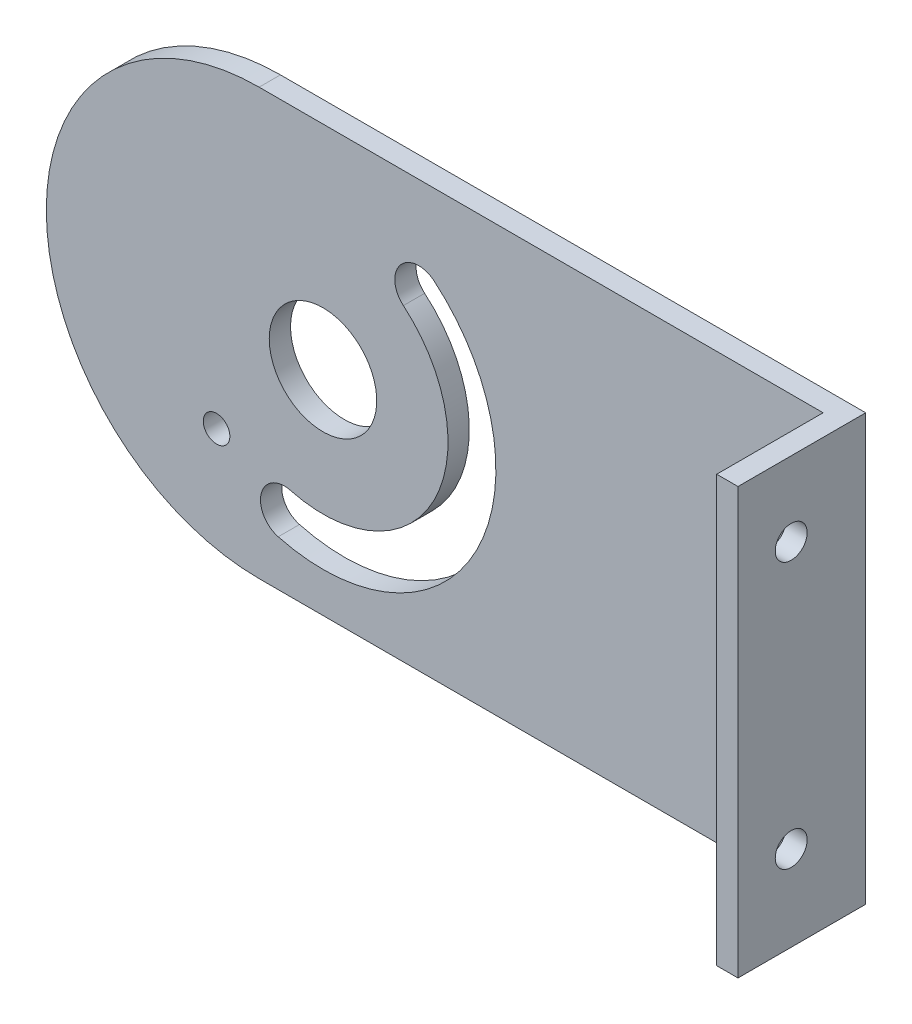
ISO-10303-21;
HEADER;
FILE_DESCRIPTION(('STEP AP214'),'2;1');
FILE_NAME('part.step','',(''),(''),'','','');
FILE_SCHEMA(('AUTOMOTIVE_DESIGN { 1 0 10303 214 1 1 1 1 }'));
ENDSEC;
DATA;
#1=APPLICATION_CONTEXT('core data for automotive mechanical design processes');
#2=APPLICATION_PROTOCOL_DEFINITION('international standard','automotive_design',2000,#1);
#3=PRODUCT_CONTEXT('',#1,'mechanical');
#4=PRODUCT('Part','Part','',(#3));
#5=PRODUCT_RELATED_PRODUCT_CATEGORY('part','',(#4));
#6=PRODUCT_DEFINITION_FORMATION('','',#4);
#7=PRODUCT_DEFINITION_CONTEXT('part definition',#1,'design');
#8=PRODUCT_DEFINITION('design','',#6,#7);
#9=PRODUCT_DEFINITION_SHAPE('','',#8);
#10=(LENGTH_UNIT() NAMED_UNIT(*) SI_UNIT(.MILLI.,.METRE.));
#11=(NAMED_UNIT(*) PLANE_ANGLE_UNIT() SI_UNIT($,.RADIAN.));
#12=(NAMED_UNIT(*) SI_UNIT($,.STERADIAN.) SOLID_ANGLE_UNIT());
#13=UNCERTAINTY_MEASURE_WITH_UNIT(LENGTH_MEASURE(1.E-05),#10,'distance_accuracy_value','');
#14=(GEOMETRIC_REPRESENTATION_CONTEXT(3) GLOBAL_UNCERTAINTY_ASSIGNED_CONTEXT((#13)) GLOBAL_UNIT_ASSIGNED_CONTEXT((#10,
#11,#12)) REPRESENTATION_CONTEXT('',''));
#15=CARTESIAN_POINT('',(0.,0.,0.));
#16=DIRECTION('',(0.,0.,1.));
#17=DIRECTION('',(1.,0.,0.));
#18=AXIS2_PLACEMENT_3D('',#15,#16,#17);
#19=CARTESIAN_POINT('',(75.,0.,2.));
#20=DIRECTION('',(0.,1.,0.));
#21=DIRECTION('',(-1.,0.,0.));
#22=AXIS2_PLACEMENT_3D('',#19,#20,#21);
#23=PLANE('',#22);
#24=DIRECTION('',(1.,0.,0.));
#25=VECTOR('',#24,1.);
#26=CARTESIAN_POINT('',(75.,0.,0.));
#27=LINE('',#26,#25);
#28=CARTESIAN_POINT('',(20.,0.,0.));
#29=VERTEX_POINT('',#28);
#30=CARTESIAN_POINT('',(75.,0.,0.));
#31=VERTEX_POINT('',#30);
#32=EDGE_CURVE('E133',#29,#31,#27,.T.);
#33=ORIENTED_EDGE('',*,*,#32,.T.);
#34=DIRECTION('',(0.,0.,-1.));
#35=VECTOR('',#34,1.);
#36=CARTESIAN_POINT('',(75.,0.,2.));
#37=LINE('',#36,#35);
#38=CARTESIAN_POINT('',(75.,0.,12.));
#39=VERTEX_POINT('',#38);
#40=EDGE_CURVE('E123',#39,#31,#37,.T.);
#41=ORIENTED_EDGE('',*,*,#40,.F.);
#42=DIRECTION('',(-1.,0.,0.));
#43=VECTOR('',#42,1.);
#44=CARTESIAN_POINT('',(75.,0.,12.));
#45=LINE('',#44,#43);
#46=CARTESIAN_POINT('',(73.,0.,12.));
#47=VERTEX_POINT('',#46);
#48=EDGE_CURVE('E126',#39,#47,#45,.T.);
#49=ORIENTED_EDGE('',*,*,#48,.T.);
#50=DIRECTION('',(0.,0.,-1.));
#51=VECTOR('',#50,1.);
#52=CARTESIAN_POINT('',(73.,0.,12.));
#53=LINE('',#52,#51);
#54=CARTESIAN_POINT('',(73.,0.,2.));
#55=VERTEX_POINT('',#54);
#56=EDGE_CURVE('E158',#47,#55,#53,.T.);
#57=ORIENTED_EDGE('',*,*,#56,.T.);
#58=DIRECTION('',(1.,0.,0.));
#59=VECTOR('',#58,1.);
#60=CARTESIAN_POINT('',(75.,0.,2.));
#61=LINE('',#60,#59);
#62=CARTESIAN_POINT('',(20.,0.,2.));
#63=VERTEX_POINT('',#62);
#64=EDGE_CURVE('E62',#63,#55,#61,.T.);
#65=ORIENTED_EDGE('',*,*,#64,.F.);
#66=DIRECTION('',(0.,0.,-1.));
#67=VECTOR('',#66,1.);
#68=CARTESIAN_POINT('',(20.,0.,2.));
#69=LINE('',#68,#67);
#70=EDGE_CURVE('E132',#63,#29,#69,.T.);
#71=ORIENTED_EDGE('',*,*,#70,.T.);
#72=EDGE_LOOP('',(#33,#41,#49,#57,#65,#71));
#73=FACE_BOUND('',#72,.T.);
#74=ADVANCED_FACE('F43',(#73),#23,.F.);
#75=CARTESIAN_POINT('',(75.,40.,2.));
#76=DIRECTION('',(-1.,0.,0.));
#77=DIRECTION('',(0.,0.,1.));
#78=AXIS2_PLACEMENT_3D('',#75,#76,#77);
#79=PLANE('',#78);
#80=CARTESIAN_POINT('',(75.,33.,7.));
#81=DIRECTION('',(-1.,0.,0.));
#82=DIRECTION('',(0.,0.,1.));
#83=AXIS2_PLACEMENT_3D('',#80,#81,#82);
#84=CIRCLE('',#83,1.5);
#85=CARTESIAN_POINT('',(75.,33.,8.5));
#86=VERTEX_POINT('',#85);
#87=EDGE_CURVE('E149',#86,#86,#84,.T.);
#88=ORIENTED_EDGE('',*,*,#87,.T.);
#89=EDGE_LOOP('',(#88));
#90=FACE_BOUND('',#89,.T.);
#91=CARTESIAN_POINT('',(75.,8.,7.));
#92=DIRECTION('',(-1.,0.,0.));
#93=DIRECTION('',(0.,0.,1.));
#94=AXIS2_PLACEMENT_3D('',#91,#92,#93);
#95=CIRCLE('',#94,1.5);
#96=CARTESIAN_POINT('',(75.,8.,8.5));
#97=VERTEX_POINT('',#96);
#98=EDGE_CURVE('E151',#97,#97,#95,.T.);
#99=ORIENTED_EDGE('',*,*,#98,.T.);
#100=EDGE_LOOP('',(#99));
#101=FACE_BOUND('',#100,.T.);
#102=DIRECTION('',(0.,1.,0.));
#103=VECTOR('',#102,1.);
#104=CARTESIAN_POINT('',(75.,40.,0.));
#105=LINE('',#104,#103);
#106=CARTESIAN_POINT('',(75.,40.,0.));
#107=VERTEX_POINT('',#106);
#108=EDGE_CURVE('E214',#31,#107,#105,.T.);
#109=ORIENTED_EDGE('',*,*,#108,.T.);
#110=DIRECTION('',(0.,0.,-1.));
#111=VECTOR('',#110,1.);
#112=CARTESIAN_POINT('',(75.,40.,2.));
#113=LINE('',#112,#111);
#114=CARTESIAN_POINT('',(75.,40.,12.));
#115=VERTEX_POINT('',#114);
#116=EDGE_CURVE('E137',#115,#107,#113,.T.);
#117=ORIENTED_EDGE('',*,*,#116,.F.);
#118=DIRECTION('',(0.,-1.,0.));
#119=VECTOR('',#118,1.);
#120=CARTESIAN_POINT('',(75.,0.,12.));
#121=LINE('',#120,#119);
#122=EDGE_CURVE('E141',#115,#39,#121,.T.);
#123=ORIENTED_EDGE('',*,*,#122,.T.);
#124=ORIENTED_EDGE('',*,*,#40,.T.);
#125=EDGE_LOOP('',(#109,#117,#123,#124));
#126=FACE_BOUND('',#125,.T.);
#127=ADVANCED_FACE('F146',(#90,#101,#126),#79,.F.);
#128=CARTESIAN_POINT('',(0.,40.,2.));
#129=DIRECTION('',(0.,-1.,0.));
#130=DIRECTION('',(0.,0.,-1.));
#131=AXIS2_PLACEMENT_3D('',#128,#129,#130);
#132=PLANE('',#131);
#133=DIRECTION('',(-1.,0.,0.));
#134=VECTOR('',#133,1.);
#135=CARTESIAN_POINT('',(0.,40.,2.));
#136=LINE('',#135,#134);
#137=CARTESIAN_POINT('',(73.,40.,2.));
#138=VERTEX_POINT('',#137);
#139=CARTESIAN_POINT('',(20.,40.,2.));
#140=VERTEX_POINT('',#139);
#141=EDGE_CURVE('E213',#138,#140,#136,.T.);
#142=ORIENTED_EDGE('',*,*,#141,.F.);
#143=DIRECTION('',(0.,0.,-1.));
#144=VECTOR('',#143,1.);
#145=CARTESIAN_POINT('',(73.,40.,12.));
#146=LINE('',#145,#144);
#147=CARTESIAN_POINT('',(73.,40.,12.));
#148=VERTEX_POINT('',#147);
#149=EDGE_CURVE('E163',#148,#138,#146,.T.);
#150=ORIENTED_EDGE('',*,*,#149,.F.);
#151=DIRECTION('',(1.,0.,0.));
#152=VECTOR('',#151,1.);
#153=CARTESIAN_POINT('',(75.,40.,12.));
#154=LINE('',#153,#152);
#155=EDGE_CURVE('E160',#148,#115,#154,.T.);
#156=ORIENTED_EDGE('',*,*,#155,.T.);
#157=ORIENTED_EDGE('',*,*,#116,.T.);
#158=DIRECTION('',(-1.,0.,0.));
#159=VECTOR('',#158,1.);
#160=CARTESIAN_POINT('',(0.,40.,0.));
#161=LINE('',#160,#159);
#162=CARTESIAN_POINT('',(20.,40.,0.));
#163=VERTEX_POINT('',#162);
#164=EDGE_CURVE('E215',#107,#163,#161,.T.);
#165=ORIENTED_EDGE('',*,*,#164,.T.);
#166=DIRECTION('',(0.,0.,-1.));
#167=VECTOR('',#166,1.);
#168=CARTESIAN_POINT('',(20.,40.,2.));
#169=LINE('',#168,#167);
#170=EDGE_CURVE('E11',#163,#140,#169,.F.);
#171=ORIENTED_EDGE('',*,*,#170,.T.);
#172=EDGE_LOOP('',(#142,#150,#156,#157,#165,#171));
#173=FACE_BOUND('',#172,.T.);
#174=ADVANCED_FACE('F243',(#173),#132,.F.);
#175=CARTESIAN_POINT('',(0.,0.,2.));
#176=DIRECTION('',(0.,0.,-1.));
#177=DIRECTION('',(-1.,0.,0.));
#178=AXIS2_PLACEMENT_3D('',#175,#176,#177);
#179=PLANE('',#178);
#180=CARTESIAN_POINT('',(16.,10.2020410288673,2.));
#181=DIRECTION('',(0.,0.,-1.));
#182=DIRECTION('',(-1.,0.,0.));
#183=AXIS2_PLACEMENT_3D('',#180,#181,#182);
#184=CIRCLE('',#183,1.25000000000004);
#185=CARTESIAN_POINT('',(14.75,10.2020410288673,2.));
#186=VERTEX_POINT('',#185);
#187=EDGE_CURVE('E204',#186,#186,#184,.T.);
#188=ORIENTED_EDGE('',*,*,#187,.T.);
#189=EDGE_LOOP('',(#188));
#190=FACE_BOUND('',#189,.T.);
#191=CARTESIAN_POINT('',(26.,20.,2.));
#192=DIRECTION('',(0.,0.,1.));
#193=DIRECTION('',(-1.,0.,0.));
#194=AXIS2_PLACEMENT_3D('',#191,#192,#193);
#195=CIRCLE('',#194,11.75);
#196=CARTESIAN_POINT('',(22.9578459976906,8.65064763846709,2.));
#197=VERTEX_POINT('',#196);
#198=CARTESIAN_POINT('',(33.5535714285714,29.0003365866766,2.));
#199=VERTEX_POINT('',#198);
#200=EDGE_CURVE('E169',#197,#199,#195,.T.);
#201=ORIENTED_EDGE('',*,*,#200,.T.);
#202=CARTESIAN_POINT('',(35.,30.7238052947636,2.));
#203=DIRECTION('',(0.,0.,-1.));
#204=DIRECTION('',(-1.,0.,0.));
#205=AXIS2_PLACEMENT_3D('',#202,#203,#204);
#206=CIRCLE('',#205,2.25);
#207=CARTESIAN_POINT('',(36.4464285714286,32.4472740028506,2.));
#208=VERTEX_POINT('',#207);
#209=EDGE_CURVE('E181',#199,#208,#206,.T.);
#210=ORIENTED_EDGE('',*,*,#209,.T.);
#211=CARTESIAN_POINT('',(26.,20.,2.));
#212=DIRECTION('',(0.,0.,-1.));
#213=DIRECTION('',(-1.,0.,0.));
#214=AXIS2_PLACEMENT_3D('',#211,#212,#213);
#215=CIRCLE('',#214,16.25);
#216=CARTESIAN_POINT('',(21.792765741487,4.30408715958214,2.));
#217=VERTEX_POINT('',#216);
#218=EDGE_CURVE('E194',#208,#217,#215,.T.);
#219=ORIENTED_EDGE('',*,*,#218,.T.);
#220=CARTESIAN_POINT('',(22.3753058695888,6.47736739902462,2.));
#221=DIRECTION('',(0.,0.,-1.));
#222=DIRECTION('',(-1.,0.,0.));
#223=AXIS2_PLACEMENT_3D('',#220,#221,#222);
#224=CIRCLE('',#223,2.25);
#225=EDGE_CURVE('E195',#217,#197,#224,.T.);
#226=ORIENTED_EDGE('',*,*,#225,.T.);
#227=EDGE_LOOP('',(#201,#210,#219,#226));
#228=FACE_BOUND('',#227,.T.);
#229=CARTESIAN_POINT('',(26.,20.,2.));
#230=DIRECTION('',(0.,0.,-1.));
#231=DIRECTION('',(-1.,0.,0.));
#232=AXIS2_PLACEMENT_3D('',#229,#230,#231);
#233=CIRCLE('',#232,5.05000000000008);
#234=CARTESIAN_POINT('',(20.9499999999999,20.,2.));
#235=VERTEX_POINT('',#234);
#236=EDGE_CURVE('E203',#235,#235,#233,.T.);
#237=ORIENTED_EDGE('',*,*,#236,.T.);
#238=EDGE_LOOP('',(#237));
#239=FACE_BOUND('',#238,.T.);
#240=ORIENTED_EDGE('',*,*,#64,.T.);
#241=DIRECTION('',(0.,1.,0.));
#242=VECTOR('',#241,1.);
#243=CARTESIAN_POINT('',(73.,0.,2.));
#244=LINE('',#243,#242);
#245=EDGE_CURVE('E56',#55,#138,#244,.T.);
#246=ORIENTED_EDGE('',*,*,#245,.T.);
#247=ORIENTED_EDGE('',*,*,#141,.T.);
#248=CARTESIAN_POINT('',(20.,20.,2.));
#249=DIRECTION('',(0.,0.,-1.));
#250=DIRECTION('',(-1.,0.,0.));
#251=AXIS2_PLACEMENT_3D('',#248,#249,#250);
#252=CIRCLE('',#251,20.);
#253=CARTESIAN_POINT('',(0.,20.,2.));
#254=VERTEX_POINT('',#253);
#255=EDGE_CURVE('E223',#140,#254,#252,.F.);
#256=ORIENTED_EDGE('',*,*,#255,.T.);
#257=CARTESIAN_POINT('',(20.,20.,2.));
#258=DIRECTION('',(0.,0.,-1.));
#259=DIRECTION('',(-1.,0.,0.));
#260=AXIS2_PLACEMENT_3D('',#257,#258,#259);
#261=CIRCLE('',#260,20.);
#262=EDGE_CURVE('E55',#254,#63,#261,.F.);
#263=ORIENTED_EDGE('',*,*,#262,.T.);
#264=EDGE_LOOP('',(#240,#246,#247,#256,#263));
#265=FACE_BOUND('',#264,.T.);
#266=ADVANCED_FACE('F226',(#190,#228,#239,#265),#179,.F.);
#267=CARTESIAN_POINT('',(0.,0.,0.));
#268=DIRECTION('',(0.,0.,-1.));
#269=DIRECTION('',(-1.,0.,0.));
#270=AXIS2_PLACEMENT_3D('',#267,#268,#269);
#271=PLANE('',#270);
#272=CARTESIAN_POINT('',(20.,20.,0.));
#273=DIRECTION('',(0.,0.,-1.));
#274=DIRECTION('',(-1.,0.,0.));
#275=AXIS2_PLACEMENT_3D('',#272,#273,#274);
#276=CIRCLE('',#275,20.);
#277=CARTESIAN_POINT('',(0.,20.,0.));
#278=VERTEX_POINT('',#277);
#279=EDGE_CURVE('E217',#278,#163,#276,.T.);
#280=ORIENTED_EDGE('',*,*,#279,.T.);
#281=ORIENTED_EDGE('',*,*,#164,.F.);
#282=ORIENTED_EDGE('',*,*,#108,.F.);
#283=ORIENTED_EDGE('',*,*,#32,.F.);
#284=CARTESIAN_POINT('',(20.,20.,0.));
#285=DIRECTION('',(0.,0.,-1.));
#286=DIRECTION('',(-1.,0.,0.));
#287=AXIS2_PLACEMENT_3D('',#284,#285,#286);
#288=CIRCLE('',#287,20.);
#289=EDGE_CURVE('E225',#29,#278,#288,.T.);
#290=ORIENTED_EDGE('',*,*,#289,.T.);
#291=EDGE_LOOP('',(#280,#281,#282,#283,#290));
#292=FACE_BOUND('',#291,.T.);
#293=CARTESIAN_POINT('',(16.,10.2020410288673,0.));
#294=DIRECTION('',(0.,0.,-1.));
#295=DIRECTION('',(-1.,0.,0.));
#296=AXIS2_PLACEMENT_3D('',#293,#294,#295);
#297=CIRCLE('',#296,1.25000000000004);
#298=CARTESIAN_POINT('',(14.75,10.2020410288673,0.));
#299=VERTEX_POINT('',#298);
#300=EDGE_CURVE('E176',#299,#299,#297,.T.);
#301=ORIENTED_EDGE('',*,*,#300,.F.);
#302=EDGE_LOOP('',(#301));
#303=FACE_BOUND('',#302,.T.);
#304=CARTESIAN_POINT('',(35.,30.7238052947636,0.));
#305=DIRECTION('',(0.,0.,-1.));
#306=DIRECTION('',(-1.,0.,0.));
#307=AXIS2_PLACEMENT_3D('',#304,#305,#306);
#308=CIRCLE('',#307,2.25);
#309=CARTESIAN_POINT('',(33.5535714285714,29.0003365866766,0.));
#310=VERTEX_POINT('',#309);
#311=CARTESIAN_POINT('',(36.4464285714286,32.4472740028506,0.));
#312=VERTEX_POINT('',#311);
#313=EDGE_CURVE('E190',#310,#312,#308,.T.);
#314=ORIENTED_EDGE('',*,*,#313,.F.);
#315=CARTESIAN_POINT('',(26.,20.,0.));
#316=DIRECTION('',(0.,0.,1.));
#317=DIRECTION('',(-1.,0.,0.));
#318=AXIS2_PLACEMENT_3D('',#315,#316,#317);
#319=CIRCLE('',#318,11.75);
#320=CARTESIAN_POINT('',(22.9578459976906,8.65064763846709,0.));
#321=VERTEX_POINT('',#320);
#322=EDGE_CURVE('E180',#321,#310,#319,.T.);
#323=ORIENTED_EDGE('',*,*,#322,.F.);
#324=CARTESIAN_POINT('',(22.3753058695888,6.47736739902462,0.));
#325=DIRECTION('',(0.,0.,-1.));
#326=DIRECTION('',(-1.,0.,0.));
#327=AXIS2_PLACEMENT_3D('',#324,#325,#326);
#328=CIRCLE('',#327,2.25);
#329=CARTESIAN_POINT('',(21.792765741487,4.30408715958214,0.));
#330=VERTEX_POINT('',#329);
#331=EDGE_CURVE('E179',#330,#321,#328,.T.);
#332=ORIENTED_EDGE('',*,*,#331,.F.);
#333=CARTESIAN_POINT('',(26.,20.,0.));
#334=DIRECTION('',(0.,0.,-1.));
#335=DIRECTION('',(-1.,0.,0.));
#336=AXIS2_PLACEMENT_3D('',#333,#334,#335);
#337=CIRCLE('',#336,16.25);
#338=EDGE_CURVE('E183',#312,#330,#337,.T.);
#339=ORIENTED_EDGE('',*,*,#338,.F.);
#340=EDGE_LOOP('',(#314,#323,#332,#339));
#341=FACE_BOUND('',#340,.T.);
#342=CARTESIAN_POINT('',(26.,20.,0.));
#343=DIRECTION('',(0.,0.,-1.));
#344=DIRECTION('',(-1.,0.,0.));
#345=AXIS2_PLACEMENT_3D('',#342,#343,#344);
#346=CIRCLE('',#345,5.05000000000008);
#347=CARTESIAN_POINT('',(20.9499999999999,20.,0.));
#348=VERTEX_POINT('',#347);
#349=EDGE_CURVE('E186',#348,#348,#346,.T.);
#350=ORIENTED_EDGE('',*,*,#349,.F.);
#351=EDGE_LOOP('',(#350));
#352=FACE_BOUND('',#351,.T.);
#353=ADVANCED_FACE('F240',(#292,#303,#341,#352),#271,.T.);
#354=CARTESIAN_POINT('',(26.,20.,2.));
#355=DIRECTION('',(0.,0.,-1.));
#356=DIRECTION('',(-1.,0.,0.));
#357=AXIS2_PLACEMENT_3D('',#354,#355,#356);
#358=CYLINDRICAL_SURFACE('',#357,5.05000000000008);
#359=ORIENTED_EDGE('',*,*,#236,.F.);
#360=EDGE_LOOP('',(#359));
#361=FACE_BOUND('',#360,.T.);
#362=ORIENTED_EDGE('',*,*,#349,.T.);
#363=EDGE_LOOP('',(#362));
#364=FACE_BOUND('',#363,.T.);
#365=ADVANCED_FACE('F272',(#361,#364),#358,.F.);
#366=CARTESIAN_POINT('',(35.,30.7238052947636,2.));
#367=DIRECTION('',(0.,0.,-1.));
#368=DIRECTION('',(-1.,0.,0.));
#369=AXIS2_PLACEMENT_3D('',#366,#367,#368);
#370=CYLINDRICAL_SURFACE('',#369,2.25);
#371=ORIENTED_EDGE('',*,*,#313,.T.);
#372=DIRECTION('',(0.,0.,-1.));
#373=VECTOR('',#372,1.);
#374=CARTESIAN_POINT('',(36.4464285714286,32.4472740028506,2.));
#375=LINE('',#374,#373);
#376=EDGE_CURVE('E168',#208,#312,#375,.T.);
#377=ORIENTED_EDGE('',*,*,#376,.F.);
#378=ORIENTED_EDGE('',*,*,#209,.F.);
#379=DIRECTION('',(0.,0.,-1.));
#380=VECTOR('',#379,1.);
#381=CARTESIAN_POINT('',(33.5535714285714,29.0003365866766,2.));
#382=LINE('',#381,#380);
#383=EDGE_CURVE('E172',#199,#310,#382,.T.);
#384=ORIENTED_EDGE('',*,*,#383,.T.);
#385=EDGE_LOOP('',(#371,#377,#378,#384));
#386=FACE_BOUND('',#385,.T.);
#387=ADVANCED_FACE('F280',(#386),#370,.F.);
#388=CARTESIAN_POINT('',(26.,20.,2.));
#389=DIRECTION('',(0.,0.,-1.));
#390=DIRECTION('',(-1.,0.,0.));
#391=AXIS2_PLACEMENT_3D('',#388,#389,#390);
#392=CYLINDRICAL_SURFACE('',#391,11.75);
#393=ORIENTED_EDGE('',*,*,#322,.T.);
#394=ORIENTED_EDGE('',*,*,#383,.F.);
#395=ORIENTED_EDGE('',*,*,#200,.F.);
#396=DIRECTION('',(0.,0.,-1.));
#397=VECTOR('',#396,1.);
#398=CARTESIAN_POINT('',(22.9578459976906,8.65064763846709,2.));
#399=LINE('',#398,#397);
#400=EDGE_CURVE('E175',#197,#321,#399,.T.);
#401=ORIENTED_EDGE('',*,*,#400,.T.);
#402=EDGE_LOOP('',(#393,#394,#395,#401));
#403=FACE_BOUND('',#402,.T.);
#404=ADVANCED_FACE('F284',(#403),#392,.T.);
#405=CARTESIAN_POINT('',(22.3753058695888,6.47736739902462,2.));
#406=DIRECTION('',(0.,0.,-1.));
#407=DIRECTION('',(-1.,0.,0.));
#408=AXIS2_PLACEMENT_3D('',#405,#406,#407);
#409=CYLINDRICAL_SURFACE('',#408,2.25);
#410=ORIENTED_EDGE('',*,*,#331,.T.);
#411=ORIENTED_EDGE('',*,*,#400,.F.);
#412=ORIENTED_EDGE('',*,*,#225,.F.);
#413=DIRECTION('',(0.,0.,-1.));
#414=VECTOR('',#413,1.);
#415=CARTESIAN_POINT('',(21.792765741487,4.30408715958214,2.));
#416=LINE('',#415,#414);
#417=EDGE_CURVE('E167',#217,#330,#416,.T.);
#418=ORIENTED_EDGE('',*,*,#417,.T.);
#419=EDGE_LOOP('',(#410,#411,#412,#418));
#420=FACE_BOUND('',#419,.T.);
#421=ADVANCED_FACE('F289',(#420),#409,.F.);
#422=CARTESIAN_POINT('',(26.,20.,2.));
#423=DIRECTION('',(0.,0.,-1.));
#424=DIRECTION('',(-1.,0.,0.));
#425=AXIS2_PLACEMENT_3D('',#422,#423,#424);
#426=CYLINDRICAL_SURFACE('',#425,16.25);
#427=ORIENTED_EDGE('',*,*,#338,.T.);
#428=ORIENTED_EDGE('',*,*,#417,.F.);
#429=ORIENTED_EDGE('',*,*,#218,.F.);
#430=ORIENTED_EDGE('',*,*,#376,.T.);
#431=EDGE_LOOP('',(#427,#428,#429,#430));
#432=FACE_BOUND('',#431,.T.);
#433=ADVANCED_FACE('F285',(#432),#426,.F.);
#434=CARTESIAN_POINT('',(16.,10.2020410288673,2.));
#435=DIRECTION('',(0.,0.,-1.));
#436=DIRECTION('',(-1.,0.,0.));
#437=AXIS2_PLACEMENT_3D('',#434,#435,#436);
#438=CYLINDRICAL_SURFACE('',#437,1.25000000000004);
#439=ORIENTED_EDGE('',*,*,#187,.F.);
#440=EDGE_LOOP('',(#439));
#441=FACE_BOUND('',#440,.T.);
#442=ORIENTED_EDGE('',*,*,#300,.T.);
#443=EDGE_LOOP('',(#442));
#444=FACE_BOUND('',#443,.T.);
#445=ADVANCED_FACE('F277',(#441,#444),#438,.F.);
#446=CARTESIAN_POINT('',(20.,20.,2.));
#447=DIRECTION('',(0.,0.,-1.));
#448=DIRECTION('',(-1.,0.,0.));
#449=AXIS2_PLACEMENT_3D('',#446,#447,#448);
#450=CYLINDRICAL_SURFACE('',#449,20.);
#451=DIRECTION('',(0.,0.,-1.));
#452=VECTOR('',#451,1.);
#453=CARTESIAN_POINT('',(0.,20.,2.));
#454=LINE('',#453,#452);
#455=EDGE_CURVE('E50',#254,#278,#454,.T.);
#456=ORIENTED_EDGE('',*,*,#455,.F.);
#457=ORIENTED_EDGE('',*,*,#255,.F.);
#458=ORIENTED_EDGE('',*,*,#170,.F.);
#459=ORIENTED_EDGE('',*,*,#279,.F.);
#460=EDGE_LOOP('',(#456,#457,#458,#459));
#461=FACE_BOUND('',#460,.T.);
#462=ADVANCED_FACE('F44',(#461),#450,.T.);
#463=CARTESIAN_POINT('',(20.,20.,2.));
#464=DIRECTION('',(0.,0.,-1.));
#465=DIRECTION('',(-1.,0.,0.));
#466=AXIS2_PLACEMENT_3D('',#463,#464,#465);
#467=CYLINDRICAL_SURFACE('',#466,20.);
#468=ORIENTED_EDGE('',*,*,#262,.F.);
#469=ORIENTED_EDGE('',*,*,#455,.T.);
#470=ORIENTED_EDGE('',*,*,#289,.F.);
#471=ORIENTED_EDGE('',*,*,#70,.F.);
#472=EDGE_LOOP('',(#468,#469,#470,#471));
#473=FACE_BOUND('',#472,.T.);
#474=ADVANCED_FACE('F234',(#473),#467,.T.);
#475=CARTESIAN_POINT('',(73.,0.,12.));
#476=DIRECTION('',(-1.,0.,0.));
#477=DIRECTION('',(0.,0.,1.));
#478=AXIS2_PLACEMENT_3D('',#475,#476,#477);
#479=PLANE('',#478);
#480=CARTESIAN_POINT('',(73.,33.,7.));
#481=DIRECTION('',(-1.,0.,0.));
#482=DIRECTION('',(0.,0.,1.));
#483=AXIS2_PLACEMENT_3D('',#480,#481,#482);
#484=CIRCLE('',#483,1.5);
#485=CARTESIAN_POINT('',(73.,33.,8.5));
#486=VERTEX_POINT('',#485);
#487=EDGE_CURVE('E401',#486,#486,#484,.T.);
#488=ORIENTED_EDGE('',*,*,#487,.F.);
#489=EDGE_LOOP('',(#488));
#490=FACE_BOUND('',#489,.T.);
#491=CARTESIAN_POINT('',(73.,8.,7.));
#492=DIRECTION('',(-1.,0.,0.));
#493=DIRECTION('',(0.,0.,1.));
#494=AXIS2_PLACEMENT_3D('',#491,#492,#493);
#495=CIRCLE('',#494,1.5);
#496=CARTESIAN_POINT('',(73.,8.,8.5));
#497=VERTEX_POINT('',#496);
#498=EDGE_CURVE('E407',#497,#497,#495,.T.);
#499=ORIENTED_EDGE('',*,*,#498,.F.);
#500=EDGE_LOOP('',(#499));
#501=FACE_BOUND('',#500,.T.);
#502=ORIENTED_EDGE('',*,*,#245,.F.);
#503=ORIENTED_EDGE('',*,*,#56,.F.);
#504=DIRECTION('',(0.,1.,0.));
#505=VECTOR('',#504,1.);
#506=CARTESIAN_POINT('',(73.,0.,12.));
#507=LINE('',#506,#505);
#508=EDGE_CURVE('E148',#47,#148,#507,.T.);
#509=ORIENTED_EDGE('',*,*,#508,.T.);
#510=ORIENTED_EDGE('',*,*,#149,.T.);
#511=EDGE_LOOP('',(#502,#503,#509,#510));
#512=FACE_BOUND('',#511,.T.);
#513=ADVANCED_FACE('F244',(#490,#501,#512),#479,.T.);
#514=CARTESIAN_POINT('',(0.,0.,12.));
#515=DIRECTION('',(0.,0.,1.));
#516=DIRECTION('',(1.,0.,0.));
#517=AXIS2_PLACEMENT_3D('',#514,#515,#516);
#518=PLANE('',#517);
#519=ORIENTED_EDGE('',*,*,#122,.F.);
#520=ORIENTED_EDGE('',*,*,#155,.F.);
#521=ORIENTED_EDGE('',*,*,#508,.F.);
#522=ORIENTED_EDGE('',*,*,#48,.F.);
#523=EDGE_LOOP('',(#519,#520,#521,#522));
#524=FACE_BOUND('',#523,.T.);
#525=ADVANCED_FACE('F142',(#524),#518,.T.);
#526=CARTESIAN_POINT('',(83.,8.,7.));
#527=DIRECTION('',(-1.,0.,0.));
#528=DIRECTION('',(0.,0.,1.));
#529=AXIS2_PLACEMENT_3D('',#526,#527,#528);
#530=CYLINDRICAL_SURFACE('',#529,1.5);
#531=ORIENTED_EDGE('',*,*,#498,.T.);
#532=EDGE_LOOP('',(#531));
#533=FACE_BOUND('',#532,.T.);
#534=ORIENTED_EDGE('',*,*,#98,.F.);
#535=EDGE_LOOP('',(#534));
#536=FACE_BOUND('',#535,.T.);
#537=ADVANCED_FACE('F251',(#533,#536),#530,.F.);
#538=CARTESIAN_POINT('',(83.,33.,7.));
#539=DIRECTION('',(-1.,0.,0.));
#540=DIRECTION('',(0.,0.,1.));
#541=AXIS2_PLACEMENT_3D('',#538,#539,#540);
#542=CYLINDRICAL_SURFACE('',#541,1.5);
#543=ORIENTED_EDGE('',*,*,#487,.T.);
#544=EDGE_LOOP('',(#543));
#545=FACE_BOUND('',#544,.T.);
#546=ORIENTED_EDGE('',*,*,#87,.F.);
#547=EDGE_LOOP('',(#546));
#548=FACE_BOUND('',#547,.T.);
#549=ADVANCED_FACE('F386',(#545,#548),#542,.F.);
#550=CLOSED_SHELL('',(#74,#127,#174,#266,#353,#365,#387,#404,#421,#433,#445,#462,#474,#513,#525,
#537,#549));
#551=MANIFOLD_SOLID_BREP('B2',#550);
#552=ADVANCED_BREP_SHAPE_REPRESENTATION('',(#18,#551),#14);
#553=SHAPE_DEFINITION_REPRESENTATION(#9,#552);
ENDSEC;
END-ISO-10303-21;
